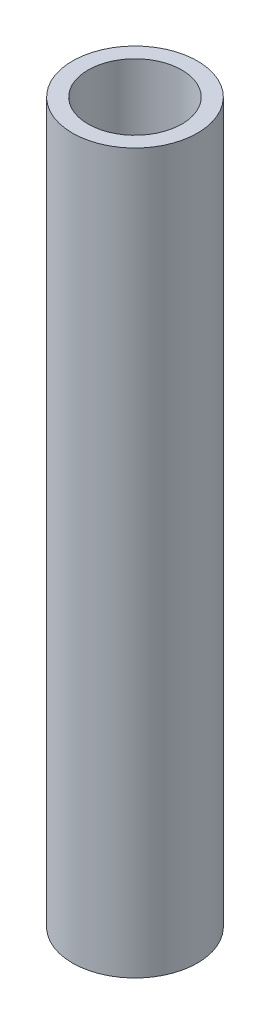
ISO-10303-21;
HEADER;
FILE_DESCRIPTION(('STEP AP214'),'2;1');
FILE_NAME('part.step','',(''),(''),'','','');
FILE_SCHEMA(('AUTOMOTIVE_DESIGN { 1 0 10303 214 1 1 1 1 }'));
ENDSEC;
DATA;
#1=APPLICATION_CONTEXT('core data for automotive mechanical design processes');
#2=APPLICATION_PROTOCOL_DEFINITION('international standard','automotive_design',2000,#1);
#3=PRODUCT_CONTEXT('',#1,'mechanical');
#4=PRODUCT('Part','Part','',(#3));
#5=PRODUCT_RELATED_PRODUCT_CATEGORY('part','',(#4));
#6=PRODUCT_DEFINITION_FORMATION('','',#4);
#7=PRODUCT_DEFINITION_CONTEXT('part definition',#1,'design');
#8=PRODUCT_DEFINITION('design','',#6,#7);
#9=PRODUCT_DEFINITION_SHAPE('','',#8);
#10=(LENGTH_UNIT() NAMED_UNIT(*) SI_UNIT(.MILLI.,.METRE.));
#11=(NAMED_UNIT(*) PLANE_ANGLE_UNIT() SI_UNIT($,.RADIAN.));
#12=(NAMED_UNIT(*) SI_UNIT($,.STERADIAN.) SOLID_ANGLE_UNIT());
#13=UNCERTAINTY_MEASURE_WITH_UNIT(LENGTH_MEASURE(1.E-05),#10,'distance_accuracy_value','');
#14=(GEOMETRIC_REPRESENTATION_CONTEXT(3) GLOBAL_UNCERTAINTY_ASSIGNED_CONTEXT((#13)) GLOBAL_UNIT_ASSIGNED_CONTEXT((#10,
#11,#12)) REPRESENTATION_CONTEXT('',''));
#15=CARTESIAN_POINT('',(0.,0.,0.));
#16=DIRECTION('',(0.,0.,1.));
#17=DIRECTION('',(1.,0.,0.));
#18=AXIS2_PLACEMENT_3D('',#15,#16,#17);
#19=CARTESIAN_POINT('',(0.,23.,0.));
#20=DIRECTION('',(0.,1.,0.));
#21=DIRECTION('',(0.,0.,1.));
#22=AXIS2_PLACEMENT_3D('',#19,#20,#21);
#23=PLANE('',#22);
#24=CARTESIAN_POINT('',(0.,23.,0.));
#25=DIRECTION('',(0.,1.,0.));
#26=DIRECTION('',(0.,0.,1.));
#27=AXIS2_PLACEMENT_3D('',#24,#25,#26);
#28=CIRCLE('',#27,4.);
#29=CARTESIAN_POINT('',(0.,23.,4.));
#30=VERTEX_POINT('',#29);
#31=EDGE_CURVE('E10',#30,#30,#28,.T.);
#32=ORIENTED_EDGE('',*,*,#31,.T.);
#33=EDGE_LOOP('',(#32));
#34=FACE_BOUND('',#33,.T.);
#35=CARTESIAN_POINT('',(0.,23.,0.));
#36=DIRECTION('',(0.,1.,0.));
#37=DIRECTION('',(0.,0.,1.));
#38=AXIS2_PLACEMENT_3D('',#35,#36,#37);
#39=CIRCLE('',#38,3.);
#40=CARTESIAN_POINT('',(0.,23.,3.));
#41=VERTEX_POINT('',#40);
#42=EDGE_CURVE('E58',#41,#41,#39,.T.);
#43=ORIENTED_EDGE('',*,*,#42,.F.);
#44=EDGE_LOOP('',(#43));
#45=FACE_BOUND('',#44,.T.);
#46=ADVANCED_FACE('F45',(#34,#45),#23,.T.);
#47=CARTESIAN_POINT('',(0.,-23.,0.));
#48=DIRECTION('',(0.,1.,0.));
#49=DIRECTION('',(0.,0.,1.));
#50=AXIS2_PLACEMENT_3D('',#47,#48,#49);
#51=PLANE('',#50);
#52=CARTESIAN_POINT('',(0.,-23.,0.));
#53=DIRECTION('',(0.,1.,0.));
#54=DIRECTION('',(0.,0.,1.));
#55=AXIS2_PLACEMENT_3D('',#52,#53,#54);
#56=CIRCLE('',#55,4.);
#57=CARTESIAN_POINT('',(0.,-23.,4.));
#58=VERTEX_POINT('',#57);
#59=EDGE_CURVE('E49',#58,#58,#56,.T.);
#60=ORIENTED_EDGE('',*,*,#59,.F.);
#61=EDGE_LOOP('',(#60));
#62=FACE_BOUND('',#61,.T.);
#63=CARTESIAN_POINT('',(0.,-23.,0.));
#64=DIRECTION('',(0.,1.,0.));
#65=DIRECTION('',(0.,0.,1.));
#66=AXIS2_PLACEMENT_3D('',#63,#64,#65);
#67=CIRCLE('',#66,3.);
#68=CARTESIAN_POINT('',(0.,-23.,3.));
#69=VERTEX_POINT('',#68);
#70=EDGE_CURVE('E60',#69,#69,#67,.T.);
#71=ORIENTED_EDGE('',*,*,#70,.T.);
#72=EDGE_LOOP('',(#71));
#73=FACE_BOUND('',#72,.T.);
#74=ADVANCED_FACE('F72',(#62,#73),#51,.F.);
#75=CARTESIAN_POINT('',(0.,23.,0.));
#76=DIRECTION('',(0.,-1.,0.));
#77=DIRECTION('',(0.,0.,-1.));
#78=AXIS2_PLACEMENT_3D('',#75,#76,#77);
#79=CYLINDRICAL_SURFACE('',#78,4.);
#80=ORIENTED_EDGE('',*,*,#31,.F.);
#81=EDGE_LOOP('',(#80));
#82=FACE_BOUND('',#81,.T.);
#83=ORIENTED_EDGE('',*,*,#59,.T.);
#84=EDGE_LOOP('',(#83));
#85=FACE_BOUND('',#84,.T.);
#86=ADVANCED_FACE('F47',(#82,#85),#79,.T.);
#87=CARTESIAN_POINT('',(0.,23.,0.));
#88=DIRECTION('',(0.,-1.,0.));
#89=DIRECTION('',(0.,0.,-1.));
#90=AXIS2_PLACEMENT_3D('',#87,#88,#89);
#91=CYLINDRICAL_SURFACE('',#90,3.);
#92=ORIENTED_EDGE('',*,*,#42,.T.);
#93=EDGE_LOOP('',(#92));
#94=FACE_BOUND('',#93,.T.);
#95=ORIENTED_EDGE('',*,*,#70,.F.);
#96=EDGE_LOOP('',(#95));
#97=FACE_BOUND('',#96,.T.);
#98=ADVANCED_FACE('F68',(#94,#97),#91,.F.);
#99=CLOSED_SHELL('',(#46,#74,#86,#98));
#100=MANIFOLD_SOLID_BREP('B2',#99);
#101=ADVANCED_BREP_SHAPE_REPRESENTATION('',(#18,#100),#14);
#102=SHAPE_DEFINITION_REPRESENTATION(#9,#101);
ENDSEC;
END-ISO-10303-21;
